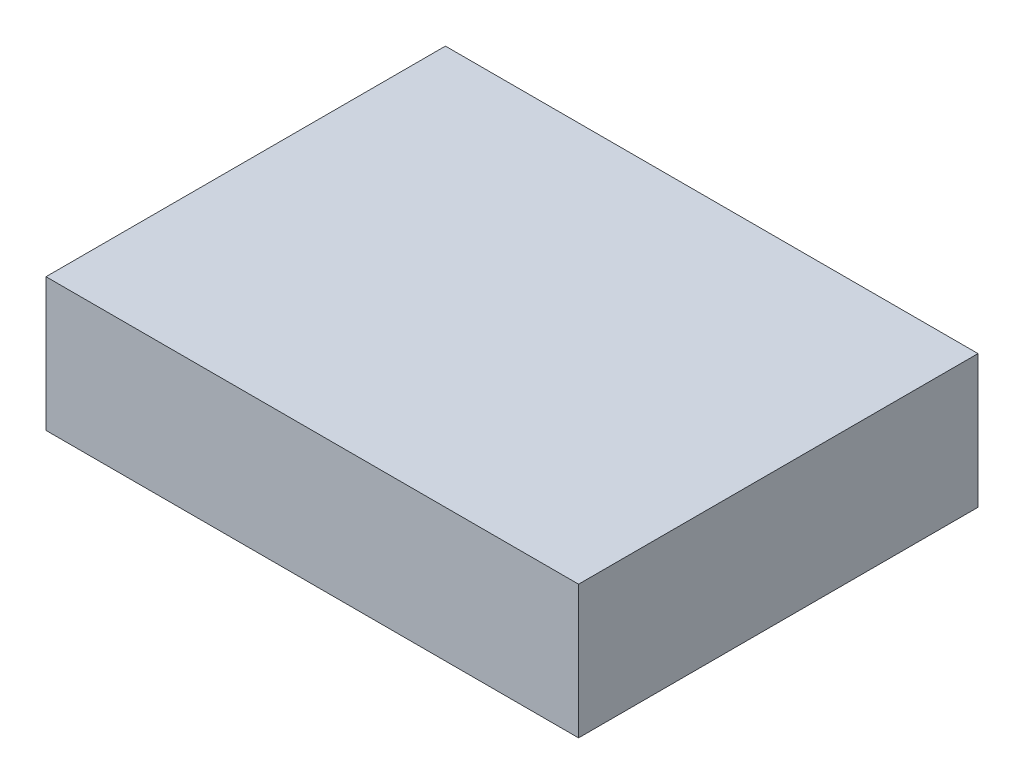
ISO-10303-21;
HEADER;
FILE_DESCRIPTION(('STEP AP214'),'2;1');
FILE_NAME('part.step','',(''),(''),'','','');
FILE_SCHEMA(('AUTOMOTIVE_DESIGN { 1 0 10303 214 1 1 1 1 }'));
ENDSEC;
DATA;
#1=APPLICATION_CONTEXT('core data for automotive mechanical design processes');
#2=APPLICATION_PROTOCOL_DEFINITION('international standard','automotive_design',2000,#1);
#3=PRODUCT_CONTEXT('',#1,'mechanical');
#4=PRODUCT('Part','Part','',(#3));
#5=PRODUCT_RELATED_PRODUCT_CATEGORY('part','',(#4));
#6=PRODUCT_DEFINITION_FORMATION('','',#4);
#7=PRODUCT_DEFINITION_CONTEXT('part definition',#1,'design');
#8=PRODUCT_DEFINITION('design','',#6,#7);
#9=PRODUCT_DEFINITION_SHAPE('','',#8);
#10=(LENGTH_UNIT() NAMED_UNIT(*) SI_UNIT(.MILLI.,.METRE.));
#11=(NAMED_UNIT(*) PLANE_ANGLE_UNIT() SI_UNIT($,.RADIAN.));
#12=(NAMED_UNIT(*) SI_UNIT($,.STERADIAN.) SOLID_ANGLE_UNIT());
#13=UNCERTAINTY_MEASURE_WITH_UNIT(LENGTH_MEASURE(1.E-05),#10,'distance_accuracy_value','');
#14=(GEOMETRIC_REPRESENTATION_CONTEXT(3) GLOBAL_UNCERTAINTY_ASSIGNED_CONTEXT((#13)) GLOBAL_UNIT_ASSIGNED_CONTEXT((#10,
#11,#12)) REPRESENTATION_CONTEXT('',''));
#15=CARTESIAN_POINT('',(0.,0.,0.));
#16=DIRECTION('',(0.,0.,1.));
#17=DIRECTION('',(1.,0.,0.));
#18=AXIS2_PLACEMENT_3D('',#15,#16,#17);
#19=CARTESIAN_POINT('',(25.4,12.7,19.05));
#20=DIRECTION('',(-1.,0.,0.));
#21=DIRECTION('',(0.,0.,1.));
#22=AXIS2_PLACEMENT_3D('',#19,#20,#21);
#23=PLANE('',#22);
#24=DIRECTION('',(0.,0.,-1.));
#25=VECTOR('',#24,1.);
#26=CARTESIAN_POINT('',(25.4,0.,19.05));
#27=LINE('',#26,#25);
#28=CARTESIAN_POINT('',(25.4,0.,19.05));
#29=VERTEX_POINT('',#28);
#30=CARTESIAN_POINT('',(25.4,0.,-19.05));
#31=VERTEX_POINT('',#30);
#32=EDGE_CURVE('E96',#29,#31,#27,.T.);
#33=ORIENTED_EDGE('',*,*,#32,.T.);
#34=DIRECTION('',(0.,-1.,0.));
#35=VECTOR('',#34,1.);
#36=CARTESIAN_POINT('',(25.4,12.7,-19.05));
#37=LINE('',#36,#35);
#38=CARTESIAN_POINT('',(25.4,12.7,-19.05));
#39=VERTEX_POINT('',#38);
#40=EDGE_CURVE('E11',#39,#31,#37,.T.);
#41=ORIENTED_EDGE('',*,*,#40,.F.);
#42=DIRECTION('',(0.,0.,-1.));
#43=VECTOR('',#42,1.);
#44=CARTESIAN_POINT('',(25.4,12.7,19.05));
#45=LINE('',#44,#43);
#46=CARTESIAN_POINT('',(25.4,12.7,19.05));
#47=VERTEX_POINT('',#46);
#48=EDGE_CURVE('E84',#47,#39,#45,.T.);
#49=ORIENTED_EDGE('',*,*,#48,.F.);
#50=DIRECTION('',(0.,-1.,0.));
#51=VECTOR('',#50,1.);
#52=CARTESIAN_POINT('',(25.4,12.7,19.05));
#53=LINE('',#52,#51);
#54=EDGE_CURVE('E92',#47,#29,#53,.T.);
#55=ORIENTED_EDGE('',*,*,#54,.T.);
#56=EDGE_LOOP('',(#33,#41,#49,#55));
#57=FACE_BOUND('',#56,.T.);
#58=ADVANCED_FACE('F33',(#57),#23,.F.);
#59=CARTESIAN_POINT('',(-25.4,12.7,-19.05));
#60=DIRECTION('',(0.,0.,1.));
#61=DIRECTION('',(1.,0.,0.));
#62=AXIS2_PLACEMENT_3D('',#59,#60,#61);
#63=PLANE('',#62);
#64=DIRECTION('',(-1.,0.,0.));
#65=VECTOR('',#64,1.);
#66=CARTESIAN_POINT('',(-25.4,0.,-19.05));
#67=LINE('',#66,#65);
#68=CARTESIAN_POINT('',(-25.4,0.,-19.05));
#69=VERTEX_POINT('',#68);
#70=EDGE_CURVE('E88',#31,#69,#67,.T.);
#71=ORIENTED_EDGE('',*,*,#70,.T.);
#72=DIRECTION('',(0.,-1.,0.));
#73=VECTOR('',#72,1.);
#74=CARTESIAN_POINT('',(-25.4,12.7,-19.05));
#75=LINE('',#74,#73);
#76=CARTESIAN_POINT('',(-25.4,12.7,-19.05));
#77=VERTEX_POINT('',#76);
#78=EDGE_CURVE('E41',#77,#69,#75,.T.);
#79=ORIENTED_EDGE('',*,*,#78,.F.);
#80=DIRECTION('',(-1.,0.,0.));
#81=VECTOR('',#80,1.);
#82=CARTESIAN_POINT('',(-25.4,12.7,-19.05));
#83=LINE('',#82,#81);
#84=EDGE_CURVE('E79',#39,#77,#83,.T.);
#85=ORIENTED_EDGE('',*,*,#84,.F.);
#86=ORIENTED_EDGE('',*,*,#40,.T.);
#87=EDGE_LOOP('',(#71,#79,#85,#86));
#88=FACE_BOUND('',#87,.T.);
#89=ADVANCED_FACE('F87',(#88),#63,.F.);
#90=CARTESIAN_POINT('',(-25.4,12.7,19.05));
#91=DIRECTION('',(1.,0.,0.));
#92=DIRECTION('',(0.,0.,-1.));
#93=AXIS2_PLACEMENT_3D('',#90,#91,#92);
#94=PLANE('',#93);
#95=DIRECTION('',(0.,0.,1.));
#96=VECTOR('',#95,1.);
#97=CARTESIAN_POINT('',(-25.4,0.,19.05));
#98=LINE('',#97,#96);
#99=CARTESIAN_POINT('',(-25.4,0.,19.05));
#100=VERTEX_POINT('',#99);
#101=EDGE_CURVE('E66',#69,#100,#98,.T.);
#102=ORIENTED_EDGE('',*,*,#101,.T.);
#103=DIRECTION('',(0.,-1.,0.));
#104=VECTOR('',#103,1.);
#105=CARTESIAN_POINT('',(-25.4,12.7,19.05));
#106=LINE('',#105,#104);
#107=CARTESIAN_POINT('',(-25.4,12.7,19.05));
#108=VERTEX_POINT('',#107);
#109=EDGE_CURVE('E89',#108,#100,#106,.T.);
#110=ORIENTED_EDGE('',*,*,#109,.F.);
#111=DIRECTION('',(0.,0.,1.));
#112=VECTOR('',#111,1.);
#113=CARTESIAN_POINT('',(-25.4,12.7,19.05));
#114=LINE('',#113,#112);
#115=EDGE_CURVE('E82',#77,#108,#114,.T.);
#116=ORIENTED_EDGE('',*,*,#115,.F.);
#117=ORIENTED_EDGE('',*,*,#78,.T.);
#118=EDGE_LOOP('',(#102,#110,#116,#117));
#119=FACE_BOUND('',#118,.T.);
#120=ADVANCED_FACE('F90',(#119),#94,.F.);
#121=CARTESIAN_POINT('',(-25.4,12.7,19.05));
#122=DIRECTION('',(0.,0.,-1.));
#123=DIRECTION('',(-1.,0.,0.));
#124=AXIS2_PLACEMENT_3D('',#121,#122,#123);
#125=PLANE('',#124);
#126=DIRECTION('',(1.,0.,0.));
#127=VECTOR('',#126,1.);
#128=CARTESIAN_POINT('',(-25.4,0.,19.05));
#129=LINE('',#128,#127);
#130=EDGE_CURVE('E72',#100,#29,#129,.T.);
#131=ORIENTED_EDGE('',*,*,#130,.T.);
#132=ORIENTED_EDGE('',*,*,#54,.F.);
#133=DIRECTION('',(1.,0.,0.));
#134=VECTOR('',#133,1.);
#135=CARTESIAN_POINT('',(-25.4,12.7,19.05));
#136=LINE('',#135,#134);
#137=EDGE_CURVE('E49',#108,#47,#136,.T.);
#138=ORIENTED_EDGE('',*,*,#137,.F.);
#139=ORIENTED_EDGE('',*,*,#109,.T.);
#140=EDGE_LOOP('',(#131,#132,#138,#139));
#141=FACE_BOUND('',#140,.T.);
#142=ADVANCED_FACE('F103',(#141),#125,.F.);
#143=CARTESIAN_POINT('',(0.,12.7,0.));
#144=DIRECTION('',(0.,-1.,0.));
#145=DIRECTION('',(0.,0.,-1.));
#146=AXIS2_PLACEMENT_3D('',#143,#144,#145);
#147=PLANE('',#146);
#148=ORIENTED_EDGE('',*,*,#48,.T.);
#149=ORIENTED_EDGE('',*,*,#84,.T.);
#150=ORIENTED_EDGE('',*,*,#115,.T.);
#151=ORIENTED_EDGE('',*,*,#137,.T.);
#152=EDGE_LOOP('',(#148,#149,#150,#151));
#153=FACE_BOUND('',#152,.T.);
#154=ADVANCED_FACE('F80',(#153),#147,.F.);
#155=CARTESIAN_POINT('',(0.,0.,0.));
#156=DIRECTION('',(0.,-1.,0.));
#157=DIRECTION('',(0.,0.,-1.));
#158=AXIS2_PLACEMENT_3D('',#155,#156,#157);
#159=PLANE('',#158);
#160=ORIENTED_EDGE('',*,*,#32,.F.);
#161=ORIENTED_EDGE('',*,*,#130,.F.);
#162=ORIENTED_EDGE('',*,*,#101,.F.);
#163=ORIENTED_EDGE('',*,*,#70,.F.);
#164=EDGE_LOOP('',(#160,#161,#162,#163));
#165=FACE_BOUND('',#164,.T.);
#166=ADVANCED_FACE('F106',(#165),#159,.T.);
#167=CLOSED_SHELL('',(#58,#89,#120,#142,#154,#166));
#168=MANIFOLD_SOLID_BREP('B2',#167);
#169=ADVANCED_BREP_SHAPE_REPRESENTATION('',(#18,#168),#14);
#170=SHAPE_DEFINITION_REPRESENTATION(#9,#169);
ENDSEC;
END-ISO-10303-21;
